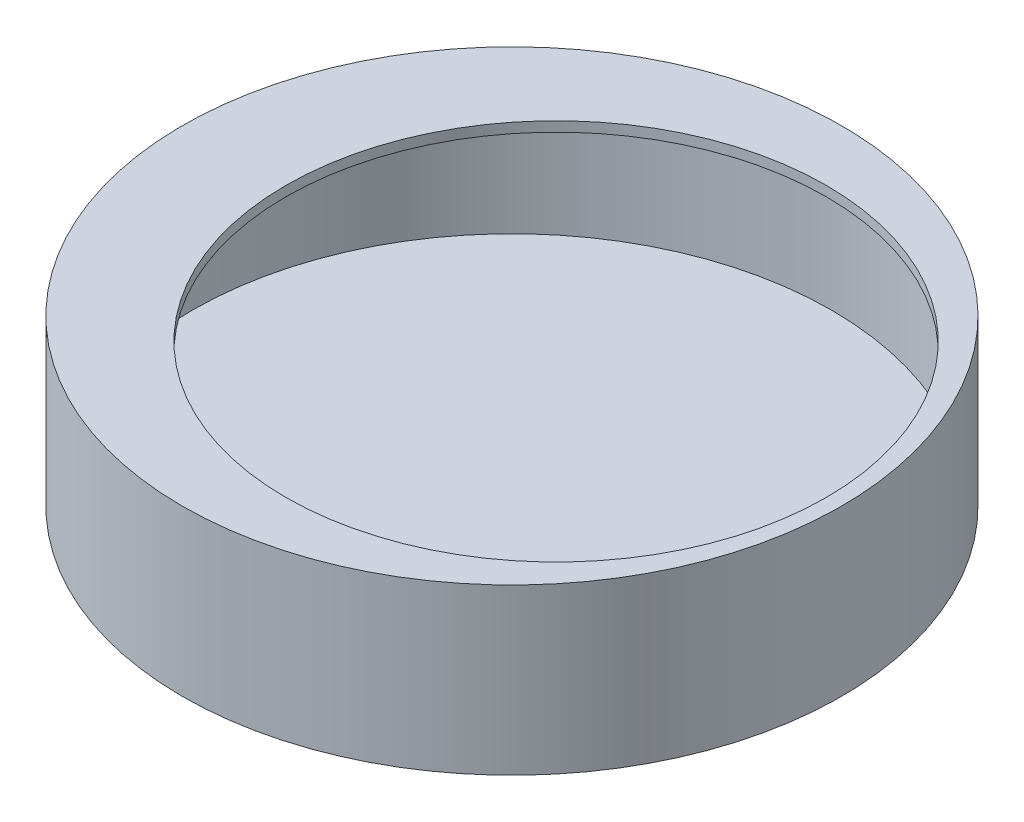
ISO-10303-21;
HEADER;
FILE_DESCRIPTION(('STEP AP214'),'2;1');
FILE_NAME('part.step','',(''),(''),'','','');
FILE_SCHEMA(('AUTOMOTIVE_DESIGN { 1 0 10303 214 1 1 1 1 }'));
ENDSEC;
DATA;
#1=APPLICATION_CONTEXT('core data for automotive mechanical design processes');
#2=APPLICATION_PROTOCOL_DEFINITION('international standard','automotive_design',2000,#1);
#3=PRODUCT_CONTEXT('',#1,'mechanical');
#4=PRODUCT('Part','Part','',(#3));
#5=PRODUCT_RELATED_PRODUCT_CATEGORY('part','',(#4));
#6=PRODUCT_DEFINITION_FORMATION('','',#4);
#7=PRODUCT_DEFINITION_CONTEXT('part definition',#1,'design');
#8=PRODUCT_DEFINITION('design','',#6,#7);
#9=PRODUCT_DEFINITION_SHAPE('','',#8);
#10=(LENGTH_UNIT() NAMED_UNIT(*) SI_UNIT(.MILLI.,.METRE.));
#11=(NAMED_UNIT(*) PLANE_ANGLE_UNIT() SI_UNIT($,.RADIAN.));
#12=(NAMED_UNIT(*) SI_UNIT($,.STERADIAN.) SOLID_ANGLE_UNIT());
#13=UNCERTAINTY_MEASURE_WITH_UNIT(LENGTH_MEASURE(1.E-05),#10,'distance_accuracy_value','');
#14=(GEOMETRIC_REPRESENTATION_CONTEXT(3) GLOBAL_UNCERTAINTY_ASSIGNED_CONTEXT((#13)) GLOBAL_UNIT_ASSIGNED_CONTEXT((#10,
#11,#12)) REPRESENTATION_CONTEXT('',''));
#15=CARTESIAN_POINT('',(0.,0.,0.));
#16=DIRECTION('',(0.,0.,1.));
#17=DIRECTION('',(1.,0.,0.));
#18=AXIS2_PLACEMENT_3D('',#15,#16,#17);
#19=CARTESIAN_POINT('',(50.,-17.7763157894737,0.));
#20=DIRECTION('',(0.,-1.,0.));
#21=DIRECTION('',(0.,0.,-1.));
#22=AXIS2_PLACEMENT_3D('',#19,#20,#21);
#23=PLANE('',#22);
#24=CARTESIAN_POINT('',(0.,-17.7763157894737,0.));
#25=DIRECTION('',(0.,1.,0.));
#26=DIRECTION('',(0.,0.,1.));
#27=AXIS2_PLACEMENT_3D('',#24,#25,#26);
#28=CIRCLE('',#27,48.5);
#29=CARTESIAN_POINT('',(0.,-17.7763157894737,48.5));
#30=VERTEX_POINT('',#29);
#31=EDGE_CURVE('E10',#30,#30,#28,.T.);
#32=ORIENTED_EDGE('',*,*,#31,.T.);
#33=EDGE_LOOP('',(#32));
#34=FACE_BOUND('',#33,.T.);
#35=ADVANCED_FACE('F33',(#34),#23,.F.);
#36=CARTESIAN_POINT('',(0.,38.4191242205271,0.));
#37=DIRECTION('',(0.,1.,0.));
#38=DIRECTION('',(0.,0.,1.));
#39=AXIS2_PLACEMENT_3D('',#36,#37,#38);
#40=CYLINDRICAL_SURFACE('',#39,48.5);
#41=ORIENTED_EDGE('',*,*,#31,.F.);
#42=EDGE_LOOP('',(#41));
#43=FACE_BOUND('',#42,.T.);
#44=CARTESIAN_POINT('',(0.,4.22368421052631,0.));
#45=DIRECTION('',(0.,1.,0.));
#46=DIRECTION('',(0.,0.,1.));
#47=AXIS2_PLACEMENT_3D('',#44,#45,#46);
#48=CIRCLE('',#47,48.5);
#49=CARTESIAN_POINT('',(0.,4.22368421052631,48.5));
#50=VERTEX_POINT('',#49);
#51=EDGE_CURVE('E40',#50,#50,#48,.T.);
#52=ORIENTED_EDGE('',*,*,#51,.T.);
#53=EDGE_LOOP('',(#52));
#54=FACE_BOUND('',#53,.T.);
#55=ADVANCED_FACE('F73',(#43,#54),#40,.F.);
#56=CARTESIAN_POINT('',(0.,4.22368421052631,0.));
#57=DIRECTION('',(0.,1.,0.));
#58=DIRECTION('',(0.,0.,1.));
#59=AXIS2_PLACEMENT_3D('',#56,#57,#58);
#60=PLANE('',#59);
#61=CARTESIAN_POINT('',(6.69886916988274,4.22368421052631,0.));
#62=DIRECTION('',(0.,1.,0.));
#63=DIRECTION('',(0.,0.,1.));
#64=AXIS2_PLACEMENT_3D('',#61,#62,#63);
#65=CIRCLE('',#64,41.);
#66=CARTESIAN_POINT('',(6.69886916988274,4.22368421052631,41.));
#67=VERTEX_POINT('',#66);
#68=EDGE_CURVE('E36',#67,#67,#65,.T.);
#69=ORIENTED_EDGE('',*,*,#68,.T.);
#70=EDGE_LOOP('',(#69));
#71=FACE_BOUND('',#70,.T.);
#72=ORIENTED_EDGE('',*,*,#51,.F.);
#73=EDGE_LOOP('',(#72));
#74=FACE_BOUND('',#73,.T.);
#75=ADVANCED_FACE('F59',(#71,#74),#60,.F.);
#76=CARTESIAN_POINT('',(6.69886916988274,-6.,0.));
#77=DIRECTION('',(0.,1.,0.));
#78=DIRECTION('',(0.,0.,1.));
#79=AXIS2_PLACEMENT_3D('',#76,#77,#78);
#80=CYLINDRICAL_SURFACE('',#79,41.);
#81=CARTESIAN_POINT('',(6.69886916988274,5.72368421052631,0.));
#82=DIRECTION('',(0.,1.,0.));
#83=DIRECTION('',(0.,0.,1.));
#84=AXIS2_PLACEMENT_3D('',#81,#82,#83);
#85=CIRCLE('',#84,41.);
#86=CARTESIAN_POINT('',(6.69886916988274,5.72368421052631,41.));
#87=VERTEX_POINT('',#86);
#88=EDGE_CURVE('E52',#87,#87,#85,.T.);
#89=ORIENTED_EDGE('',*,*,#88,.T.);
#90=EDGE_LOOP('',(#89));
#91=FACE_BOUND('',#90,.T.);
#92=ORIENTED_EDGE('',*,*,#68,.F.);
#93=EDGE_LOOP('',(#92));
#94=FACE_BOUND('',#93,.T.);
#95=ADVANCED_FACE('F62',(#91,#94),#80,.F.);
#96=CARTESIAN_POINT('',(0.,5.72368421052631,0.));
#97=DIRECTION('',(0.,1.,0.));
#98=DIRECTION('',(0.,0.,1.));
#99=AXIS2_PLACEMENT_3D('',#96,#97,#98);
#100=PLANE('',#99);
#101=ORIENTED_EDGE('',*,*,#88,.F.);
#102=EDGE_LOOP('',(#101));
#103=FACE_BOUND('',#102,.T.);
#104=CARTESIAN_POINT('',(0.,5.72368421052631,0.));
#105=DIRECTION('',(0.,1.,0.));
#106=DIRECTION('',(0.,0.,1.));
#107=AXIS2_PLACEMENT_3D('',#104,#105,#106);
#108=CIRCLE('',#107,50.);
#109=CARTESIAN_POINT('',(0.,5.72368421052631,50.));
#110=VERTEX_POINT('',#109);
#111=EDGE_CURVE('E44',#110,#110,#108,.T.);
#112=ORIENTED_EDGE('',*,*,#111,.T.);
#113=EDGE_LOOP('',(#112));
#114=FACE_BOUND('',#113,.T.);
#115=ADVANCED_FACE('F64',(#103,#114),#100,.T.);
#116=CARTESIAN_POINT('',(0.,38.4191242205271,0.));
#117=DIRECTION('',(0.,1.,0.));
#118=DIRECTION('',(0.,0.,1.));
#119=AXIS2_PLACEMENT_3D('',#116,#117,#118);
#120=CYLINDRICAL_SURFACE('',#119,50.);
#121=CARTESIAN_POINT('',(0.,-19.2763157894737,0.));
#122=DIRECTION('',(0.,1.,0.));
#123=DIRECTION('',(0.,0.,1.));
#124=AXIS2_PLACEMENT_3D('',#121,#122,#123);
#125=CIRCLE('',#124,50.);
#126=CARTESIAN_POINT('',(0.,-19.2763157894737,50.));
#127=VERTEX_POINT('',#126);
#128=EDGE_CURVE('E49',#127,#127,#125,.T.);
#129=ORIENTED_EDGE('',*,*,#128,.T.);
#130=EDGE_LOOP('',(#129));
#131=FACE_BOUND('',#130,.T.);
#132=ORIENTED_EDGE('',*,*,#111,.F.);
#133=EDGE_LOOP('',(#132));
#134=FACE_BOUND('',#133,.T.);
#135=ADVANCED_FACE('F70',(#131,#134),#120,.T.);
#136=CARTESIAN_POINT('',(50.,-19.2763157894737,0.));
#137=DIRECTION('',(0.,-1.,0.));
#138=DIRECTION('',(0.,0.,-1.));
#139=AXIS2_PLACEMENT_3D('',#136,#137,#138);
#140=PLANE('',#139);
#141=ORIENTED_EDGE('',*,*,#128,.F.);
#142=EDGE_LOOP('',(#141));
#143=FACE_BOUND('',#142,.T.);
#144=ADVANCED_FACE('F86',(#143),#140,.T.);
#145=CLOSED_SHELL('',(#35,#55,#75,#95,#115,#135,#144));
#146=MANIFOLD_SOLID_BREP('B2',#145);
#147=ADVANCED_BREP_SHAPE_REPRESENTATION('',(#18,#146),#14);
#148=SHAPE_DEFINITION_REPRESENTATION(#9,#147);
ENDSEC;
END-ISO-10303-21;
